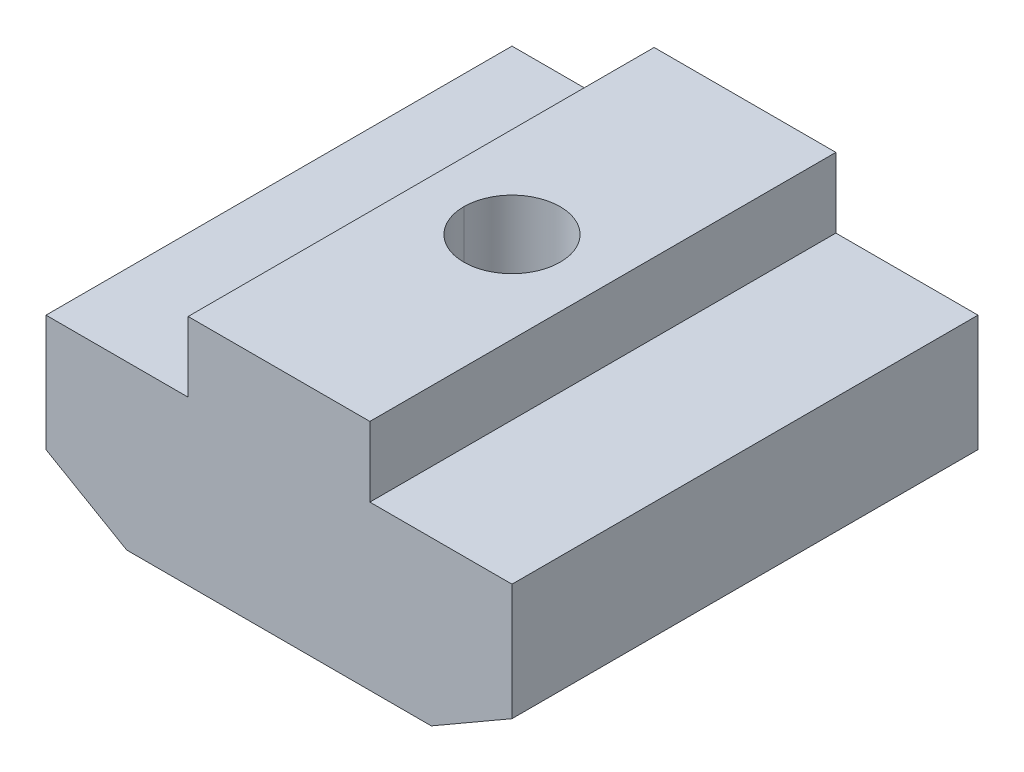
ISO-10303-21;
HEADER;
FILE_DESCRIPTION(('STEP AP214'),'2;1');
FILE_NAME('part.step','',(''),(''),'','','');
FILE_SCHEMA(('AUTOMOTIVE_DESIGN { 1 0 10303 214 1 1 1 1 }'));
ENDSEC;
DATA;
#1=APPLICATION_CONTEXT('core data for automotive mechanical design processes');
#2=APPLICATION_PROTOCOL_DEFINITION('international standard','automotive_design',2000,#1);
#3=PRODUCT_CONTEXT('',#1,'mechanical');
#4=PRODUCT('Part','Part','',(#3));
#5=PRODUCT_RELATED_PRODUCT_CATEGORY('part','',(#4));
#6=PRODUCT_DEFINITION_FORMATION('','',#4);
#7=PRODUCT_DEFINITION_CONTEXT('part definition',#1,'design');
#8=PRODUCT_DEFINITION('design','',#6,#7);
#9=PRODUCT_DEFINITION_SHAPE('','',#8);
#10=(LENGTH_UNIT() NAMED_UNIT(*) SI_UNIT(.MILLI.,.METRE.));
#11=(NAMED_UNIT(*) PLANE_ANGLE_UNIT() SI_UNIT($,.RADIAN.));
#12=(NAMED_UNIT(*) SI_UNIT($,.STERADIAN.) SOLID_ANGLE_UNIT());
#13=UNCERTAINTY_MEASURE_WITH_UNIT(LENGTH_MEASURE(1.E-05),#10,'distance_accuracy_value','');
#14=(GEOMETRIC_REPRESENTATION_CONTEXT(3) GLOBAL_UNCERTAINTY_ASSIGNED_CONTEXT((#13)) GLOBAL_UNIT_ASSIGNED_CONTEXT((#10,
#11,#12)) REPRESENTATION_CONTEXT('',''));
#15=CARTESIAN_POINT('',(0.,0.,0.));
#16=DIRECTION('',(0.,0.,1.));
#17=DIRECTION('',(1.,0.,0.));
#18=AXIS2_PLACEMENT_3D('',#15,#16,#17);
#19=CARTESIAN_POINT('',(-10.,-1.5,0.));
#20=DIRECTION('',(0.50000000000019,0.866025403784329,0.));
#21=DIRECTION('',(0.,0.,-1.));
#22=AXIS2_PLACEMENT_3D('',#19,#20,#21);
#23=PLANE('',#22);
#24=DIRECTION('',(0.,0.,1.));
#25=VECTOR('',#24,1.);
#26=CARTESIAN_POINT('',(-10.,-1.5,0.));
#27=LINE('',#26,#25);
#28=CARTESIAN_POINT('',(-10.,-1.5,-10.));
#29=VERTEX_POINT('',#28);
#30=CARTESIAN_POINT('',(-10.,-1.5,10.));
#31=VERTEX_POINT('',#30);
#32=EDGE_CURVE('E171',#29,#31,#27,.T.);
#33=ORIENTED_EDGE('',*,*,#32,.F.);
#34=DIRECTION('',(0.866025403784329,-0.50000000000019,0.));
#35=VECTOR('',#34,1.);
#36=CARTESIAN_POINT('',(-8.26794919243,-2.5,-10.));
#37=LINE('',#36,#35);
#38=CARTESIAN_POINT('',(-6.53589838486,-3.5,-10.));
#39=VERTEX_POINT('',#38);
#40=EDGE_CURVE('E178',#29,#39,#37,.T.);
#41=ORIENTED_EDGE('',*,*,#40,.T.);
#42=DIRECTION('',(0.,0.,1.));
#43=VECTOR('',#42,1.);
#44=CARTESIAN_POINT('',(-6.53589838486,-3.5,0.));
#45=LINE('',#44,#43);
#46=CARTESIAN_POINT('',(-6.53589838486,-3.5,10.));
#47=VERTEX_POINT('',#46);
#48=EDGE_CURVE('E11',#39,#47,#45,.T.);
#49=ORIENTED_EDGE('',*,*,#48,.T.);
#50=DIRECTION('',(-0.866025403784329,0.50000000000019,0.));
#51=VECTOR('',#50,1.);
#52=CARTESIAN_POINT('',(-8.26794919243,-2.5,10.));
#53=LINE('',#52,#51);
#54=EDGE_CURVE('E25',#47,#31,#53,.T.);
#55=ORIENTED_EDGE('',*,*,#54,.T.);
#56=EDGE_LOOP('',(#33,#41,#49,#55));
#57=FACE_BOUND('',#56,.T.);
#58=ADVANCED_FACE('F17',(#57),#23,.F.);
#59=CARTESIAN_POINT('',(10.,-3.5,0.));
#60=DIRECTION('',(0.,1.,0.));
#61=DIRECTION('',(1.,0.,0.));
#62=AXIS2_PLACEMENT_3D('',#59,#60,#61);
#63=PLANE('',#62);
#64=CARTESIAN_POINT('',(0.,-3.5,0.));
#65=DIRECTION('',(0.,1.,0.));
#66=DIRECTION('',(1.,0.,0.));
#67=AXIS2_PLACEMENT_3D('',#64,#65,#66);
#68=CIRCLE('',#67,2.067);
#69=CARTESIAN_POINT('',(-2.067,-3.5,0.));
#70=VERTEX_POINT('',#69);
#71=CARTESIAN_POINT('',(2.067,-3.5,0.));
#72=VERTEX_POINT('',#71);
#73=EDGE_CURVE('E275',#70,#72,#68,.T.);
#74=ORIENTED_EDGE('',*,*,#73,.T.);
#75=CARTESIAN_POINT('',(0.,-3.5,0.));
#76=DIRECTION('',(0.,1.,0.));
#77=DIRECTION('',(1.,0.,0.));
#78=AXIS2_PLACEMENT_3D('',#75,#76,#77);
#79=CIRCLE('',#78,2.067);
#80=EDGE_CURVE('E247',#72,#70,#79,.T.);
#81=ORIENTED_EDGE('',*,*,#80,.T.);
#82=EDGE_LOOP('',(#74,#81));
#83=FACE_BOUND('',#82,.T.);
#84=ORIENTED_EDGE('',*,*,#48,.F.);
#85=DIRECTION('',(1.,0.,0.));
#86=VECTOR('',#85,1.);
#87=CARTESIAN_POINT('',(0.,-3.5,-10.));
#88=LINE('',#87,#86);
#89=CARTESIAN_POINT('',(6.53589838486,-3.5,-10.));
#90=VERTEX_POINT('',#89);
#91=EDGE_CURVE('E174',#39,#90,#88,.T.);
#92=ORIENTED_EDGE('',*,*,#91,.T.);
#93=DIRECTION('',(0.,0.,1.));
#94=VECTOR('',#93,1.);
#95=CARTESIAN_POINT('',(6.53589838486,-3.5,0.));
#96=LINE('',#95,#94);
#97=CARTESIAN_POINT('',(6.53589838486,-3.5,10.));
#98=VERTEX_POINT('',#97);
#99=EDGE_CURVE('E198',#90,#98,#96,.T.);
#100=ORIENTED_EDGE('',*,*,#99,.T.);
#101=DIRECTION('',(1.,0.,0.));
#102=VECTOR('',#101,1.);
#103=CARTESIAN_POINT('',(0.,-3.5,10.));
#104=LINE('',#103,#102);
#105=EDGE_CURVE('E177',#47,#98,#104,.T.);
#106=ORIENTED_EDGE('',*,*,#105,.F.);
#107=EDGE_LOOP('',(#84,#92,#100,#106));
#108=FACE_BOUND('',#107,.T.);
#109=ADVANCED_FACE('F441',(#83,#108),#63,.F.);
#110=CARTESIAN_POINT('',(0.,0.,10.));
#111=DIRECTION('',(0.,0.,1.));
#112=DIRECTION('',(1.,0.,0.));
#113=AXIS2_PLACEMENT_3D('',#110,#111,#112);
#114=PLANE('',#113);
#115=ORIENTED_EDGE('',*,*,#105,.T.);
#116=DIRECTION('',(-0.866025403784329,-0.50000000000019,0.));
#117=VECTOR('',#116,1.);
#118=CARTESIAN_POINT('',(8.26794919243,-2.5,10.));
#119=LINE('',#118,#117);
#120=CARTESIAN_POINT('',(10.,-1.5,10.));
#121=VERTEX_POINT('',#120);
#122=EDGE_CURVE('E197',#121,#98,#119,.T.);
#123=ORIENTED_EDGE('',*,*,#122,.F.);
#124=DIRECTION('',(0.,1.,0.));
#125=VECTOR('',#124,1.);
#126=CARTESIAN_POINT('',(10.,1.,10.));
#127=LINE('',#126,#125);
#128=CARTESIAN_POINT('',(10.,3.5,10.));
#129=VERTEX_POINT('',#128);
#130=EDGE_CURVE('E218',#121,#129,#127,.T.);
#131=ORIENTED_EDGE('',*,*,#130,.T.);
#132=DIRECTION('',(-1.,0.,0.));
#133=VECTOR('',#132,1.);
#134=CARTESIAN_POINT('',(6.95,3.5,10.));
#135=LINE('',#134,#133);
#136=CARTESIAN_POINT('',(3.9,3.5,10.));
#137=VERTEX_POINT('',#136);
#138=EDGE_CURVE('E206',#129,#137,#135,.T.);
#139=ORIENTED_EDGE('',*,*,#138,.T.);
#140=DIRECTION('',(0.,1.,0.));
#141=VECTOR('',#140,1.);
#142=CARTESIAN_POINT('',(3.9,5.,10.));
#143=LINE('',#142,#141);
#144=CARTESIAN_POINT('',(3.9,6.5,10.));
#145=VERTEX_POINT('',#144);
#146=EDGE_CURVE('E152',#137,#145,#143,.T.);
#147=ORIENTED_EDGE('',*,*,#146,.T.);
#148=DIRECTION('',(-1.,0.,0.));
#149=VECTOR('',#148,1.);
#150=CARTESIAN_POINT('',(0.,6.5,10.));
#151=LINE('',#150,#149);
#152=CARTESIAN_POINT('',(-3.9,6.5,10.));
#153=VERTEX_POINT('',#152);
#154=EDGE_CURVE('E149',#145,#153,#151,.T.);
#155=ORIENTED_EDGE('',*,*,#154,.T.);
#156=DIRECTION('',(0.,-1.,0.));
#157=VECTOR('',#156,1.);
#158=CARTESIAN_POINT('',(-3.9,5.,10.));
#159=LINE('',#158,#157);
#160=CARTESIAN_POINT('',(-3.9,3.5,10.));
#161=VERTEX_POINT('',#160);
#162=EDGE_CURVE('E134',#153,#161,#159,.T.);
#163=ORIENTED_EDGE('',*,*,#162,.T.);
#164=DIRECTION('',(-1.,0.,0.));
#165=VECTOR('',#164,1.);
#166=CARTESIAN_POINT('',(-6.95,3.5,10.));
#167=LINE('',#166,#165);
#168=CARTESIAN_POINT('',(-10.,3.5,10.));
#169=VERTEX_POINT('',#168);
#170=EDGE_CURVE('E183',#161,#169,#167,.T.);
#171=ORIENTED_EDGE('',*,*,#170,.T.);
#172=DIRECTION('',(0.,-1.,0.));
#173=VECTOR('',#172,1.);
#174=CARTESIAN_POINT('',(-10.,1.,10.));
#175=LINE('',#174,#173);
#176=EDGE_CURVE('E230',#169,#31,#175,.T.);
#177=ORIENTED_EDGE('',*,*,#176,.T.);
#178=ORIENTED_EDGE('',*,*,#54,.F.);
#179=EDGE_LOOP('',(#115,#123,#131,#139,#147,#155,#163,#171,#177,#178));
#180=FACE_BOUND('',#179,.T.);
#181=ADVANCED_FACE('F150',(#180),#114,.T.);
#182=CARTESIAN_POINT('',(0.,0.,-10.));
#183=DIRECTION('',(0.,0.,1.));
#184=DIRECTION('',(1.,0.,0.));
#185=AXIS2_PLACEMENT_3D('',#182,#183,#184);
#186=PLANE('',#185);
#187=ORIENTED_EDGE('',*,*,#40,.F.);
#188=DIRECTION('',(0.,-1.,0.));
#189=VECTOR('',#188,1.);
#190=CARTESIAN_POINT('',(-10.,1.,-10.));
#191=LINE('',#190,#189);
#192=CARTESIAN_POINT('',(-10.,3.5,-10.));
#193=VERTEX_POINT('',#192);
#194=EDGE_CURVE('E234',#193,#29,#191,.T.);
#195=ORIENTED_EDGE('',*,*,#194,.F.);
#196=DIRECTION('',(-1.,0.,0.));
#197=VECTOR('',#196,1.);
#198=CARTESIAN_POINT('',(-6.95,3.5,-10.));
#199=LINE('',#198,#197);
#200=CARTESIAN_POINT('',(-3.9,3.5,-10.));
#201=VERTEX_POINT('',#200);
#202=EDGE_CURVE('E146',#201,#193,#199,.T.);
#203=ORIENTED_EDGE('',*,*,#202,.F.);
#204=DIRECTION('',(0.,-1.,0.));
#205=VECTOR('',#204,1.);
#206=CARTESIAN_POINT('',(-3.9,5.,-10.));
#207=LINE('',#206,#205);
#208=CARTESIAN_POINT('',(-3.9,6.5,-10.));
#209=VERTEX_POINT('',#208);
#210=EDGE_CURVE('E157',#209,#201,#207,.T.);
#211=ORIENTED_EDGE('',*,*,#210,.F.);
#212=DIRECTION('',(-1.,0.,0.));
#213=VECTOR('',#212,1.);
#214=CARTESIAN_POINT('',(0.,6.5,-10.));
#215=LINE('',#214,#213);
#216=CARTESIAN_POINT('',(3.9,6.5,-10.));
#217=VERTEX_POINT('',#216);
#218=EDGE_CURVE('E161',#217,#209,#215,.T.);
#219=ORIENTED_EDGE('',*,*,#218,.F.);
#220=DIRECTION('',(0.,1.,0.));
#221=VECTOR('',#220,1.);
#222=CARTESIAN_POINT('',(3.9,5.,-10.));
#223=LINE('',#222,#221);
#224=CARTESIAN_POINT('',(3.9,3.5,-10.));
#225=VERTEX_POINT('',#224);
#226=EDGE_CURVE('E209',#225,#217,#223,.T.);
#227=ORIENTED_EDGE('',*,*,#226,.F.);
#228=DIRECTION('',(-1.,0.,0.));
#229=VECTOR('',#228,1.);
#230=CARTESIAN_POINT('',(6.95,3.5,-10.));
#231=LINE('',#230,#229);
#232=CARTESIAN_POINT('',(10.,3.5,-10.));
#233=VERTEX_POINT('',#232);
#234=EDGE_CURVE('E193',#233,#225,#231,.T.);
#235=ORIENTED_EDGE('',*,*,#234,.F.);
#236=DIRECTION('',(0.,1.,0.));
#237=VECTOR('',#236,1.);
#238=CARTESIAN_POINT('',(10.,1.,-10.));
#239=LINE('',#238,#237);
#240=CARTESIAN_POINT('',(10.,-1.5,-10.));
#241=VERTEX_POINT('',#240);
#242=EDGE_CURVE('E215',#241,#233,#239,.T.);
#243=ORIENTED_EDGE('',*,*,#242,.F.);
#244=DIRECTION('',(0.866025403784329,0.50000000000019,0.));
#245=VECTOR('',#244,1.);
#246=CARTESIAN_POINT('',(8.26794919243,-2.5,-10.));
#247=LINE('',#246,#245);
#248=EDGE_CURVE('E194',#90,#241,#247,.T.);
#249=ORIENTED_EDGE('',*,*,#248,.F.);
#250=ORIENTED_EDGE('',*,*,#91,.F.);
#251=EDGE_LOOP('',(#187,#195,#203,#211,#219,#227,#235,#243,#249,#250));
#252=FACE_BOUND('',#251,.T.);
#253=ADVANCED_FACE('F282',(#252),#186,.F.);
#254=CARTESIAN_POINT('',(-10.,-3.5,0.));
#255=DIRECTION('',(1.,0.,0.));
#256=DIRECTION('',(0.,1.,0.));
#257=AXIS2_PLACEMENT_3D('',#254,#255,#256);
#258=PLANE('',#257);
#259=ORIENTED_EDGE('',*,*,#32,.T.);
#260=ORIENTED_EDGE('',*,*,#176,.F.);
#261=DIRECTION('',(0.,0.,1.));
#262=VECTOR('',#261,1.);
#263=CARTESIAN_POINT('',(-10.,3.5,0.));
#264=LINE('',#263,#262);
#265=EDGE_CURVE('E182',#193,#169,#264,.T.);
#266=ORIENTED_EDGE('',*,*,#265,.F.);
#267=ORIENTED_EDGE('',*,*,#194,.T.);
#268=EDGE_LOOP('',(#259,#260,#266,#267));
#269=FACE_BOUND('',#268,.T.);
#270=ADVANCED_FACE('F288',(#269),#258,.F.);
#271=CARTESIAN_POINT('',(10.,-1.5,0.));
#272=DIRECTION('',(-0.50000000000019,0.866025403784329,0.));
#273=DIRECTION('',(0.,0.,1.));
#274=AXIS2_PLACEMENT_3D('',#271,#272,#273);
#275=PLANE('',#274);
#276=ORIENTED_EDGE('',*,*,#99,.F.);
#277=ORIENTED_EDGE('',*,*,#248,.T.);
#278=DIRECTION('',(0.,0.,1.));
#279=VECTOR('',#278,1.);
#280=CARTESIAN_POINT('',(10.,-1.5,0.));
#281=LINE('',#280,#279);
#282=EDGE_CURVE('E214',#241,#121,#281,.T.);
#283=ORIENTED_EDGE('',*,*,#282,.T.);
#284=ORIENTED_EDGE('',*,*,#122,.T.);
#285=EDGE_LOOP('',(#276,#277,#283,#284));
#286=FACE_BOUND('',#285,.T.);
#287=ADVANCED_FACE('F423',(#286),#275,.F.);
#288=CARTESIAN_POINT('',(10.,3.5,0.));
#289=DIRECTION('',(-1.,0.,0.));
#290=DIRECTION('',(0.,0.,1.));
#291=AXIS2_PLACEMENT_3D('',#288,#289,#290);
#292=PLANE('',#291);
#293=ORIENTED_EDGE('',*,*,#282,.F.);
#294=ORIENTED_EDGE('',*,*,#242,.T.);
#295=DIRECTION('',(0.,0.,1.));
#296=VECTOR('',#295,1.);
#297=CARTESIAN_POINT('',(10.,3.5,0.));
#298=LINE('',#297,#296);
#299=EDGE_CURVE('E186',#233,#129,#298,.T.);
#300=ORIENTED_EDGE('',*,*,#299,.T.);
#301=ORIENTED_EDGE('',*,*,#130,.F.);
#302=EDGE_LOOP('',(#293,#294,#300,#301));
#303=FACE_BOUND('',#302,.T.);
#304=ADVANCED_FACE('F413',(#303),#292,.F.);
#305=CARTESIAN_POINT('',(3.9,6.5,0.));
#306=DIRECTION('',(-1.,0.,0.));
#307=DIRECTION('',(0.,0.,1.));
#308=AXIS2_PLACEMENT_3D('',#305,#306,#307);
#309=PLANE('',#308);
#310=DIRECTION('',(0.,0.,1.));
#311=VECTOR('',#310,1.);
#312=CARTESIAN_POINT('',(3.9,3.5,0.));
#313=LINE('',#312,#311);
#314=EDGE_CURVE('E202',#225,#137,#313,.T.);
#315=ORIENTED_EDGE('',*,*,#314,.F.);
#316=ORIENTED_EDGE('',*,*,#226,.T.);
#317=DIRECTION('',(0.,0.,1.));
#318=VECTOR('',#317,1.);
#319=CARTESIAN_POINT('',(3.9,6.5,0.));
#320=LINE('',#319,#318);
#321=EDGE_CURVE('E167',#217,#145,#320,.T.);
#322=ORIENTED_EDGE('',*,*,#321,.T.);
#323=ORIENTED_EDGE('',*,*,#146,.F.);
#324=EDGE_LOOP('',(#315,#316,#322,#323));
#325=FACE_BOUND('',#324,.T.);
#326=ADVANCED_FACE('F401',(#325),#309,.F.);
#327=CARTESIAN_POINT('',(3.9,3.5,0.));
#328=DIRECTION('',(0.,-1.,0.));
#329=DIRECTION('',(0.,0.,-1.));
#330=AXIS2_PLACEMENT_3D('',#327,#328,#329);
#331=PLANE('',#330);
#332=ORIENTED_EDGE('',*,*,#299,.F.);
#333=ORIENTED_EDGE('',*,*,#234,.T.);
#334=ORIENTED_EDGE('',*,*,#314,.T.);
#335=ORIENTED_EDGE('',*,*,#138,.F.);
#336=EDGE_LOOP('',(#332,#333,#334,#335));
#337=FACE_BOUND('',#336,.T.);
#338=ADVANCED_FACE('F390',(#337),#331,.F.);
#339=CARTESIAN_POINT('',(3.9,3.5,0.));
#340=DIRECTION('',(0.,-1.,0.));
#341=DIRECTION('',(0.,0.,-1.));
#342=AXIS2_PLACEMENT_3D('',#339,#340,#341);
#343=PLANE('',#342);
#344=DIRECTION('',(0.,0.,1.));
#345=VECTOR('',#344,1.);
#346=CARTESIAN_POINT('',(-3.9,3.5,0.));
#347=LINE('',#346,#345);
#348=EDGE_CURVE('E142',#201,#161,#347,.T.);
#349=ORIENTED_EDGE('',*,*,#348,.F.);
#350=ORIENTED_EDGE('',*,*,#202,.T.);
#351=ORIENTED_EDGE('',*,*,#265,.T.);
#352=ORIENTED_EDGE('',*,*,#170,.F.);
#353=EDGE_LOOP('',(#349,#350,#351,#352));
#354=FACE_BOUND('',#353,.T.);
#355=ADVANCED_FACE('F285',(#354),#343,.F.);
#356=CARTESIAN_POINT('',(-3.9,3.5,0.));
#357=DIRECTION('',(1.,0.,0.));
#358=DIRECTION('',(0.,1.,0.));
#359=AXIS2_PLACEMENT_3D('',#356,#357,#358);
#360=PLANE('',#359);
#361=DIRECTION('',(0.,0.,1.));
#362=VECTOR('',#361,1.);
#363=CARTESIAN_POINT('',(-3.9,6.5,0.));
#364=LINE('',#363,#362);
#365=EDGE_CURVE('E139',#209,#153,#364,.T.);
#366=ORIENTED_EDGE('',*,*,#365,.F.);
#367=ORIENTED_EDGE('',*,*,#210,.T.);
#368=ORIENTED_EDGE('',*,*,#348,.T.);
#369=ORIENTED_EDGE('',*,*,#162,.F.);
#370=EDGE_LOOP('',(#366,#367,#368,#369));
#371=FACE_BOUND('',#370,.T.);
#372=ADVANCED_FACE('F136',(#371),#360,.F.);
#373=CARTESIAN_POINT('',(-3.9,6.5,0.));
#374=DIRECTION('',(0.,-1.,0.));
#375=DIRECTION('',(0.,0.,-1.));
#376=AXIS2_PLACEMENT_3D('',#373,#374,#375);
#377=PLANE('',#376);
#378=CARTESIAN_POINT('',(0.,6.5,0.));
#379=DIRECTION('',(0.,1.,0.));
#380=DIRECTION('',(1.,0.,0.));
#381=AXIS2_PLACEMENT_3D('',#378,#379,#380);
#382=CIRCLE('',#381,2.067);
#383=CARTESIAN_POINT('',(-2.067,6.5,0.));
#384=VERTEX_POINT('',#383);
#385=CARTESIAN_POINT('',(2.067,6.5,0.));
#386=VERTEX_POINT('',#385);
#387=EDGE_CURVE('E264',#384,#386,#382,.T.);
#388=ORIENTED_EDGE('',*,*,#387,.F.);
#389=CARTESIAN_POINT('',(0.,6.5,0.));
#390=DIRECTION('',(0.,1.,0.));
#391=DIRECTION('',(1.,0.,0.));
#392=AXIS2_PLACEMENT_3D('',#389,#390,#391);
#393=CIRCLE('',#392,2.067);
#394=EDGE_CURVE('E249',#386,#384,#393,.T.);
#395=ORIENTED_EDGE('',*,*,#394,.F.);
#396=EDGE_LOOP('',(#388,#395));
#397=FACE_BOUND('',#396,.T.);
#398=ORIENTED_EDGE('',*,*,#321,.F.);
#399=ORIENTED_EDGE('',*,*,#218,.T.);
#400=ORIENTED_EDGE('',*,*,#365,.T.);
#401=ORIENTED_EDGE('',*,*,#154,.F.);
#402=EDGE_LOOP('',(#398,#399,#400,#401));
#403=FACE_BOUND('',#402,.T.);
#404=ADVANCED_FACE('F159',(#397,#403),#377,.F.);
#405=CARTESIAN_POINT('',(0.,-3.5,0.));
#406=DIRECTION('',(0.,1.,0.));
#407=DIRECTION('',(1.,0.,0.));
#408=AXIS2_PLACEMENT_3D('',#405,#406,#407);
#409=CYLINDRICAL_SURFACE('',#408,2.067);
#410=ORIENTED_EDGE('',*,*,#80,.F.);
#411=DIRECTION('',(0.,-1.,0.));
#412=VECTOR('',#411,1.);
#413=CARTESIAN_POINT('',(2.067,1.34499999996,0.));
#414=LINE('',#413,#412);
#415=EDGE_CURVE('E258',#386,#72,#414,.T.);
#416=ORIENTED_EDGE('',*,*,#415,.F.);
#417=ORIENTED_EDGE('',*,*,#394,.T.);
#418=DIRECTION('',(0.,-1.,0.));
#419=VECTOR('',#418,1.);
#420=CARTESIAN_POINT('',(-2.067,1.34499999996,0.));
#421=LINE('',#420,#419);
#422=EDGE_CURVE('E271',#384,#70,#421,.T.);
#423=ORIENTED_EDGE('',*,*,#422,.T.);
#424=EDGE_LOOP('',(#410,#416,#417,#423));
#425=FACE_BOUND('',#424,.T.);
#426=ADVANCED_FACE('F349',(#425),#409,.F.);
#427=CARTESIAN_POINT('',(0.,-3.5,0.));
#428=DIRECTION('',(0.,1.,0.));
#429=DIRECTION('',(1.,0.,0.));
#430=AXIS2_PLACEMENT_3D('',#427,#428,#429);
#431=CYLINDRICAL_SURFACE('',#430,2.067);
#432=ORIENTED_EDGE('',*,*,#73,.F.);
#433=ORIENTED_EDGE('',*,*,#422,.F.);
#434=ORIENTED_EDGE('',*,*,#387,.T.);
#435=ORIENTED_EDGE('',*,*,#415,.T.);
#436=EDGE_LOOP('',(#432,#433,#434,#435));
#437=FACE_BOUND('',#436,.T.);
#438=ADVANCED_FACE('F360',(#437),#431,.F.);
#439=CLOSED_SHELL('',(#58,#109,#181,#253,#270,#287,#304,#326,#338,#355,#372,#404,#426,#438));
#440=MANIFOLD_SOLID_BREP('B1',#439);
#441=ADVANCED_BREP_SHAPE_REPRESENTATION('',(#18,#440),#14);
#442=SHAPE_DEFINITION_REPRESENTATION(#9,#441);
ENDSEC;
END-ISO-10303-21;
